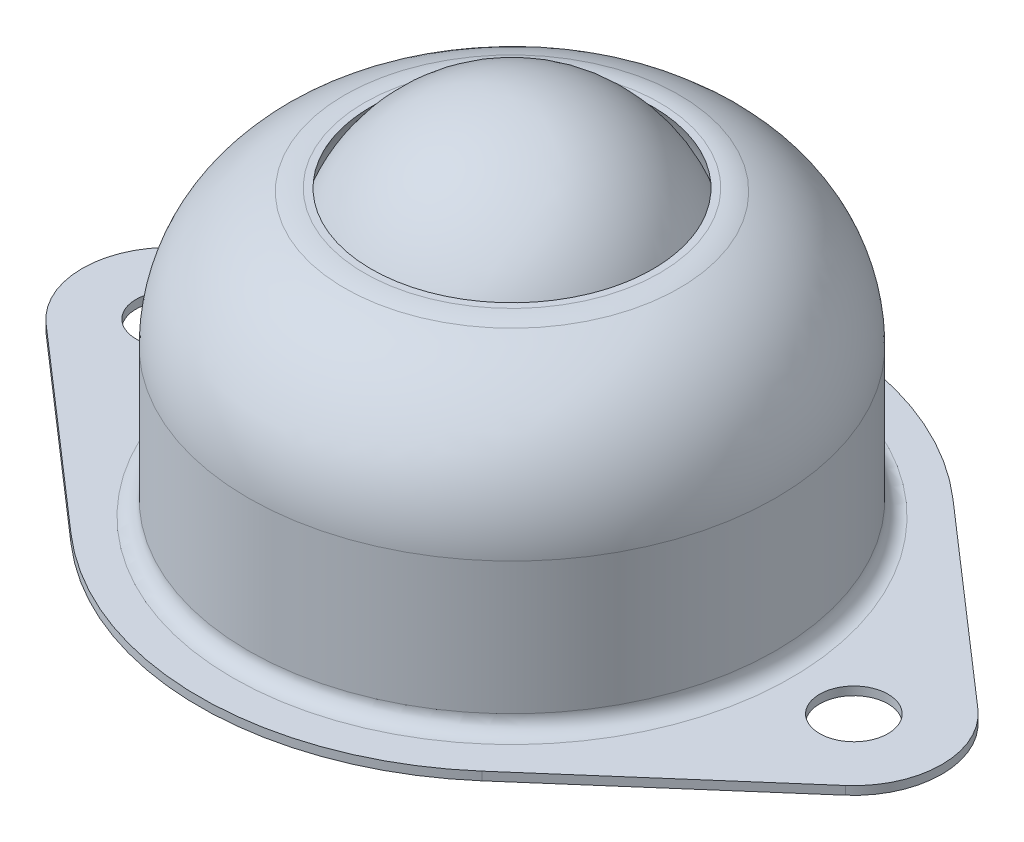
ISO-10303-21;
HEADER;
FILE_DESCRIPTION(('STEP AP214'),'2;1');
FILE_NAME('part.step','',(''),(''),'','','');
FILE_SCHEMA(('AUTOMOTIVE_DESIGN { 1 0 10303 214 1 1 1 1 }'));
ENDSEC;
DATA;
#1=APPLICATION_CONTEXT('core data for automotive mechanical design processes');
#2=APPLICATION_PROTOCOL_DEFINITION('international standard','automotive_design',2000,#1);
#3=PRODUCT_CONTEXT('',#1,'mechanical');
#4=PRODUCT('Part','Part','',(#3));
#5=PRODUCT_RELATED_PRODUCT_CATEGORY('part','',(#4));
#6=PRODUCT_DEFINITION_FORMATION('','',#4);
#7=PRODUCT_DEFINITION_CONTEXT('part definition',#1,'design');
#8=PRODUCT_DEFINITION('design','',#6,#7);
#9=PRODUCT_DEFINITION_SHAPE('','',#8);
#10=(LENGTH_UNIT() NAMED_UNIT(*) SI_UNIT(.MILLI.,.METRE.));
#11=(NAMED_UNIT(*) PLANE_ANGLE_UNIT() SI_UNIT($,.RADIAN.));
#12=(NAMED_UNIT(*) SI_UNIT($,.STERADIAN.) SOLID_ANGLE_UNIT());
#13=UNCERTAINTY_MEASURE_WITH_UNIT(LENGTH_MEASURE(1.E-05),#10,'distance_accuracy_value','');
#14=(GEOMETRIC_REPRESENTATION_CONTEXT(3) GLOBAL_UNCERTAINTY_ASSIGNED_CONTEXT((#13)) GLOBAL_UNIT_ASSIGNED_CONTEXT((#10,
#11,#12)) REPRESENTATION_CONTEXT('',''));
#15=CARTESIAN_POINT('',(0.,0.,0.));
#16=DIRECTION('',(0.,0.,1.));
#17=DIRECTION('',(1.,0.,0.));
#18=AXIS2_PLACEMENT_3D('',#15,#16,#17);
#19=CARTESIAN_POINT('',(0.,17.4625,0.));
#20=DIRECTION('',(1.,0.,0.));
#21=DIRECTION('',(0.,-1.,0.));
#22=AXIS2_PLACEMENT_3D('',#19,#20,#21);
#23=SPHERICAL_SURFACE('',#22,12.7);
#24=CARTESIAN_POINT('',(12.7,17.4625,0.));
#25=VERTEX_POINT('',#24);
#26=VERTEX_LOOP('',#25);
#27=FACE_BOUND('',#26,.T.);
#28=ADVANCED_FACE('P0_F31',(#27),#23,.T.);
#29=CLOSED_SHELL('',(#28));
#30=MANIFOLD_SOLID_BREP('P0_B2',#29);
#31=CARTESIAN_POINT('',(0.,17.4625,0.));
#32=DIRECTION('',(1.,0.,0.));
#33=DIRECTION('',(0.,-1.,0.));
#34=AXIS2_PLACEMENT_3D('',#31,#32,#33);
#35=SPHERICAL_SURFACE('',#34,13.081);
#36=CARTESIAN_POINT('',(13.081,17.4625,0.));
#37=VERTEX_POINT('',#36);
#38=VERTEX_LOOP('',#37);
#39=FACE_BOUND('',#38,.T.);
#40=CARTESIAN_POINT('',(-13.081,17.4625,0.));
#41=VERTEX_POINT('',#40);
#42=VERTEX_LOOP('',#41);
#43=FACE_BOUND('',#42,.T.);
#44=CARTESIAN_POINT('',(11.4363482370904,23.8125,0.));
#45=CARTESIAN_POINT('',(11.4363464651006,23.8125,-0.321064718853675));
#46=CARTESIAN_POINT('',(11.4228165397614,23.8125,-0.642187616067949));
#47=CARTESIAN_POINT('',(11.3687752471854,23.8125,-1.2822831873216));
#48=CARTESIAN_POINT('',(11.3282505814105,23.8125,-1.60125472325458));
#49=CARTESIAN_POINT('',(11.2203938728238,23.8125,-2.23526421980352));
#50=CARTESIAN_POINT('',(11.1530111397144,23.8125,-2.55029357394347));
#51=CARTESIAN_POINT('',(10.9919181130495,23.8125,-3.17354712938374));
#52=CARTESIAN_POINT('',(10.8982076555274,23.8125,-3.48177128828905));
#53=CARTESIAN_POINT('',(10.6852181213579,23.8125,-4.08896023589708));
#54=CARTESIAN_POINT('',(10.5659609070567,23.8125,-4.38793269318859));
#55=CARTESIAN_POINT('',(10.3026748499466,23.8125,-4.97477448169461));
#56=CARTESIAN_POINT('',(10.158645256946,23.8125,-5.2626434763353));
#57=CARTESIAN_POINT('',(9.84691720443379,23.8125,-5.82508463307515));
#58=CARTESIAN_POINT('',(9.67923026351429,23.8125,-6.09966317932872));
#59=CARTESIAN_POINT('',(9.32132779111319,23.8125,-6.63371962388473));
#60=CARTESIAN_POINT('',(9.13111243098029,23.8125,-6.89319763701779));
#61=CARTESIAN_POINT('',(8.72946422940428,23.8125,-7.3952608299586));
#62=CARTESIAN_POINT('',(8.51802722145206,23.8125,-7.637842676593));
#63=CARTESIAN_POINT('',(8.07546955467022,23.8125,-8.10433343541315));
#64=CARTESIAN_POINT('',(7.84434885652176,23.8125,-8.32824231029725));
#65=CARTESIAN_POINT('',(7.36404660321942,23.8125,-8.75581316669281));
#66=CARTESIAN_POINT('',(7.11486350623993,23.8125,-8.95947341623261));
#67=CARTESIAN_POINT('',(6.60022571327373,23.8125,-9.34507715736311));
#68=CARTESIAN_POINT('',(6.33477102357822,23.8125,-9.52702065735023));
#69=CARTESIAN_POINT('',(5.78948760375894,23.8125,-9.86789096239132));
#70=CARTESIAN_POINT('',(5.5096594145273,23.8125,-10.0268186327004));
#71=CARTESIAN_POINT('',(4.93760923566528,23.8125,-10.3205355380822));
#72=CARTESIAN_POINT('',(4.64538724562102,23.8125,-10.4553247723489));
#73=CARTESIAN_POINT('',(4.05063021208211,23.8125,-10.6998052053973));
#74=CARTESIAN_POINT('',(3.74809527909912,23.8125,-10.8094966730252));
#75=CARTESIAN_POINT('',(3.13486021244921,23.8125,-11.003003589483));
#76=CARTESIAN_POINT('',(2.82416007884726,23.8125,-11.0868190385188));
#77=CARTESIAN_POINT('',(2.19680179733197,23.8125,-11.2279784250021));
#78=CARTESIAN_POINT('',(1.88014361754577,23.8125,-11.2853222207963));
#79=CARTESIAN_POINT('',(1.24312210829783,23.8125,-11.3731299594902));
#80=CARTESIAN_POINT('',(0.922758778815074,23.8125,-11.4035939022374));
#81=CARTESIAN_POINT('',(0.280604562936458,23.8125,-11.4374253540858));
#82=CARTESIAN_POINT('',(-0.0411863234594056,23.8125,-11.440792863187));
#83=CARTESIAN_POINT('',(-0.683907911286681,23.8125,-11.4204075066819));
#84=CARTESIAN_POINT('',(-1.00483861272297,23.8125,-11.3966546412293));
#85=CARTESIAN_POINT('',(-1.64355649676614,23.8125,-11.3221976040765));
#86=CARTESIAN_POINT('',(-1.96134369618493,23.8125,-11.2714935765944));
#87=CARTESIAN_POINT('',(-2.59151706973476,23.8125,-11.1434947759947));
#88=CARTESIAN_POINT('',(-2.90390324382282,23.8125,-11.0662000026655));
#89=CARTESIAN_POINT('',(-3.52105701934832,23.8125,-10.8855682545087));
#90=CARTESIAN_POINT('',(-3.82582453913541,23.8125,-10.782231000711));
#91=CARTESIAN_POINT('',(-4.42557078209706,23.8125,-10.5502493814035));
#92=CARTESIAN_POINT('',(-4.72054950559851,23.8125,-10.4216050167389));
#93=CARTESIAN_POINT('',(-5.2986319039311,23.8125,-10.1399184648294));
#94=CARTESIAN_POINT('',(-5.58173513178282,23.8125,-9.98687536028418));
#95=CARTESIAN_POINT('',(-6.13404200830228,23.8125,-9.65748286299214));
#96=CARTESIAN_POINT('',(-6.40324565159591,23.8125,-9.48113346123432));
#97=CARTESIAN_POINT('',(-6.92581684391129,23.8125,-9.10639830044978));
#98=CARTESIAN_POINT('',(-7.17918574423292,23.8125,-8.90801442581703));
#99=CARTESIAN_POINT('',(-7.66831088577904,23.8125,-8.49060873299592));
#100=CARTESIAN_POINT('',(-7.90406716218517,23.8125,-8.27158695603422));
#101=CARTESIAN_POINT('',(-8.35624715294302,23.8125,-7.81450711235984));
#102=CARTESIAN_POINT('',(-8.57267466049871,23.8125,-7.57645279817252));
#103=CARTESIAN_POINT('',(-8.9847128481599,23.8125,-7.0829601461183));
#104=CARTESIAN_POINT('',(-9.18032336993133,23.8125,-6.82752167605167));
#105=CARTESIAN_POINT('',(-9.54942533441807,23.8125,-6.30094957906027));
#106=CARTESIAN_POINT('',(-9.72290599313476,23.8125,-6.02980839298448));
#107=CARTESIAN_POINT('',(-10.0463980769443,23.8125,-5.47388060602103));
#108=CARTESIAN_POINT('',(-10.1964102127097,23.8125,-5.18909441867183));
#109=CARTESIAN_POINT('',(-10.4720222281921,23.8125,-4.60764710662637));
#110=CARTESIAN_POINT('',(-10.5976011723826,23.8125,-4.31097605856494));
#111=CARTESIAN_POINT('',(-10.8232919948511,23.8125,-3.70809994337834));
#112=CARTESIAN_POINT('',(-10.9234040317332,23.8125,-3.4018949356426));
#113=CARTESIAN_POINT('',(-11.0972834490954,23.8125,-2.78272851252262));
#114=CARTESIAN_POINT('',(-11.1711003349139,23.8125,-2.46978098235236));
#115=CARTESIAN_POINT('',(-11.2921017596822,23.8125,-1.83890741590195));
#116=CARTESIAN_POINT('',(-11.3392994039618,23.8125,-1.52098390879777));
#117=CARTESIAN_POINT('',(-11.3941243901092,23.8125,-1.00213945296147));
#118=CARTESIAN_POINT('',(-11.4099533895389,23.8125,-0.802049457802363));
#119=CARTESIAN_POINT('',(-11.4310658667841,23.8125,-0.401313883953147));
#120=CARTESIAN_POINT('',(-11.4363493445997,23.8125,-0.200668305263037));
#121=CARTESIAN_POINT('',(-11.4363464651007,23.8125,0.321064718849707));
#122=CARTESIAN_POINT('',(-11.4228165397616,23.8125,0.642187616063984));
#123=CARTESIAN_POINT('',(-11.3687752471859,23.8125,1.28228318731765));
#124=CARTESIAN_POINT('',(-11.3282505814111,23.8125,1.60125472325064));
#125=CARTESIAN_POINT('',(-11.2203938728246,23.8125,2.23526421979963));
#126=CARTESIAN_POINT('',(-11.1530111397153,23.8125,2.55029357393959));
#127=CARTESIAN_POINT('',(-10.9919181130506,23.8125,3.17354712937992));
#128=CARTESIAN_POINT('',(-10.8982076555286,23.8125,3.48177128828527));
#129=CARTESIAN_POINT('',(-10.6852181213593,23.8125,4.08896023589338));
#130=CARTESIAN_POINT('',(-10.5659609070582,23.8125,4.38793269318492));
#131=CARTESIAN_POINT('',(-10.3026748499483,23.8125,4.97477448169104));
#132=CARTESIAN_POINT('',(-10.1586452569478,23.8125,5.26264347633178));
#133=CARTESIAN_POINT('',(-9.84691720443583,23.8125,5.82508463307174));
#134=CARTESIAN_POINT('',(-9.67923026351642,23.8125,6.09966317932537));
#135=CARTESIAN_POINT('',(-9.32132779111551,23.8125,6.6337196238815));
#136=CARTESIAN_POINT('',(-9.1311124309827,23.8125,6.89319763701463));
#137=CARTESIAN_POINT('',(-8.72946422940687,23.8125,7.39526082995558));
#138=CARTESIAN_POINT('',(-8.51802722145473,23.8125,7.63784267659004));
#139=CARTESIAN_POINT('',(-8.07546955467305,23.8125,8.10433343541035));
#140=CARTESIAN_POINT('',(-7.84434885652467,23.8125,8.32824231029453));
#141=CARTESIAN_POINT('',(-7.36404660322248,23.8125,8.75581316669026));
#142=CARTESIAN_POINT('',(-7.11486350624306,23.8125,8.95947341623014));
#143=CARTESIAN_POINT('',(-6.60022571327699,23.8125,9.34507715736082));
#144=CARTESIAN_POINT('',(-6.33477102358155,23.8125,9.52702065734803));
#145=CARTESIAN_POINT('',(-5.78948760376239,23.8125,9.86789096238931));
#146=CARTESIAN_POINT('',(-5.5096594145308,23.8125,10.0268186326985));
#147=CARTESIAN_POINT('',(-4.93760923566889,23.8125,10.3205355380805));
#148=CARTESIAN_POINT('',(-4.64538724562467,23.8125,10.4553247723472));
#149=CARTESIAN_POINT('',(-4.05063021208583,23.8125,10.6998052053959));
#150=CARTESIAN_POINT('',(-3.74809527910289,23.8125,10.8094966730239));
#151=CARTESIAN_POINT('',(-3.13486021245304,23.8125,11.0030035894819));
#152=CARTESIAN_POINT('',(-2.82416007885113,23.8125,11.0868190385178));
#153=CARTESIAN_POINT('',(-2.19680179733588,23.8125,11.2279784250013));
#154=CARTESIAN_POINT('',(-1.8801436175497,23.8125,11.2853222207956));
#155=CARTESIAN_POINT('',(-1.24312210830179,23.8125,11.3731299594897));
#156=CARTESIAN_POINT('',(-0.922758778819049,23.8125,11.4035939022371));
#157=CARTESIAN_POINT('',(-0.280604562940446,23.8125,11.4374253540857));
#158=CARTESIAN_POINT('',(0.0411863234554154,23.8125,11.440792863187));
#159=CARTESIAN_POINT('',(0.683907911282697,23.8125,11.4204075066821));
#160=CARTESIAN_POINT('',(1.004838612719,23.8125,11.3966546412297));
#161=CARTESIAN_POINT('',(1.64355649676219,23.8125,11.322197604077));
#162=CARTESIAN_POINT('',(1.96134369618099,23.8125,11.271493576595));
#163=CARTESIAN_POINT('',(2.59151706973087,23.8125,11.1434947759956));
#164=CARTESIAN_POINT('',(2.90390324381895,23.8125,11.0662000026665));
#165=CARTESIAN_POINT('',(3.52105701934452,23.8125,10.88556825451));
#166=CARTESIAN_POINT('',(3.82582453913164,23.8125,10.7822310007124));
#167=CARTESIAN_POINT('',(4.42557078209338,23.8125,10.5502493814051));
#168=CARTESIAN_POINT('',(4.72054950559487,23.8125,10.4216050167405));
#169=CARTESIAN_POINT('',(5.29863190392756,23.8125,10.1399184648312));
#170=CARTESIAN_POINT('',(5.58173513177933,23.8125,9.98687536028611));
#171=CARTESIAN_POINT('',(6.1340420082989,23.8125,9.65748286299427));
#172=CARTESIAN_POINT('',(6.4032456515926,23.8125,9.48113346123654));
#173=CARTESIAN_POINT('',(6.92581684390811,23.8125,9.10639830045218));
#174=CARTESIAN_POINT('',(7.1791857442298,23.8125,8.90801442581953));
#175=CARTESIAN_POINT('',(7.66831088577608,23.8125,8.49060873299858));
#176=CARTESIAN_POINT('',(7.90406716218228,23.8125,8.27158695603696));
#177=CARTESIAN_POINT('',(8.35624715294028,23.8125,7.81450711236274));
#178=CARTESIAN_POINT('',(8.57267466049606,23.8125,7.57645279817549));
#179=CARTESIAN_POINT('',(8.98471284815743,23.8125,7.08296014612142));
#180=CARTESIAN_POINT('',(9.18032336992894,23.8125,6.82752167605486));
#181=CARTESIAN_POINT('',(9.54942533441586,23.8125,6.30094957906359));
#182=CARTESIAN_POINT('',(9.72290599313264,23.8125,6.02980839298785));
#183=CARTESIAN_POINT('',(10.0463980769424,23.8125,5.47388060602452));
#184=CARTESIAN_POINT('',(10.1964102127079,23.8125,5.18909441867536));
#185=CARTESIAN_POINT('',(10.4720222281904,23.8125,4.60764710663));
#186=CARTESIAN_POINT('',(10.5976011723811,23.8125,4.31097605856862));
#187=CARTESIAN_POINT('',(10.8232919948498,23.8125,3.70809994338209));
#188=CARTESIAN_POINT('',(10.923404031732,23.8125,3.40189493564639));
#189=CARTESIAN_POINT('',(11.0972834490944,23.8125,2.78272851252647));
#190=CARTESIAN_POINT('',(11.1711003349131,23.8125,2.46978098235624));
#191=CARTESIAN_POINT('',(11.2921017596816,23.8125,1.83890741590587));
#192=CARTESIAN_POINT('',(11.3392994039613,23.8125,1.5209839088017));
#193=CARTESIAN_POINT('',(11.394124390109,23.8125,1.0021394529641));
#194=CARTESIAN_POINT('',(11.4099533895388,23.8125,0.80204945780368));
#195=CARTESIAN_POINT('',(11.4310658667842,23.8125,0.401313883951825));
#196=CARTESIAN_POINT('',(11.4363493445997,23.8125,0.200668305260392));
#197=CARTESIAN_POINT('',(11.4363482370904,23.8125,0.));
#198=B_SPLINE_CURVE_WITH_KNOTS('',3,(#44,#45,#46,#47,#48,#49,#50,#51,#52,#53,#54,#55,#56,#57,
#58,#59,#60,#61,#62,#63,#64,#65,#66,#67,#68,#69,#70,#71,#72,#73,#74,#75,#76,#77,#78,#79,#80,#81,
#82,#83,#84,#85,#86,#87,#88,#89,#90,#91,#92,#93,#94,#95,#96,#97,#98,#99,#100,#101,#102,#103,
#104,#105,#106,#107,#108,#109,#110,#111,#112,#113,#114,#115,#116,#117,#118,#119,#120,#121,#122,
#123,#124,#125,#126,#127,#128,#129,#130,#131,#132,#133,#134,#135,#136,#137,#138,#139,#140,#141,
#142,#143,#144,#145,#146,#147,#148,#149,#150,#151,#152,#153,#154,#155,#156,#157,#158,#159,#160,
#161,#162,#163,#164,#165,#166,#167,#168,#169,#170,#171,#172,#173,#174,#175,#176,#177,#178,#179,
#180,#181,#182,#183,#184,#185,#186,#187,#188,#189,#190,#191,#192,#193,#194,#195,#196,#197),
.UNSPECIFIED.,.T.,.F.,(4,2,2,2,2,2,2,2,2,2,2,2,2,2,2,2,2,2,2,2,2,2,2,2,2,2,2,2,2,2,2,2,2,2,2,2,
2,2,2,2,2,2,2,2,2,2,2,2,2,2,2,2,2,2,2,2,2,2,2,2,2,2,2,2,2,2,2,2,2,2,2,2,2,2,2,2,4),(0.,
0.96301045674964,1.92649567678627,2.89180799698352,3.857126329189,4.82162184030589,
5.78614656476355,6.75020327951492,7.71425266222715,8.67849169124256,9.64273264640336,
10.607056007348,11.571378995452,12.5356657214665,13.4999524796831,14.4642289080202,
15.428505328683,16.3927869092561,17.3570684952986,18.3213500813412,19.2856316619142,
20.249908082577,21.2141845109141,22.1784712691308,23.1427579951453,24.1070809832492,
25.0714043441939,26.0356452993547,26.9998843283701,27.9639337110823,28.9279904258337,
29.8925151502913,30.8570106614082,31.8223289936137,32.787641313811,33.7511265338476,
34.7141369905972,35.3160270923587,35.9179171941201,36.8809276508697,37.8444128709063,
38.8097251911036,39.7750435233091,40.739539034426,41.7040637588836,42.668120473635,
43.6321698563472,44.5964088853626,45.5606498405235,46.5249732014681,47.4892961895721,
48.4535829155866,49.4178696738032,50.3821461021403,51.3464225228031,52.3107041033762,
53.2749856894187,54.2392672754613,55.2035488560343,56.1678252766971,57.1321017050342,
58.0963884632509,59.0606751892654,60.0249981773694,60.989321538314,61.9535624934748,
62.9178015224902,63.8818509052024,64.8459076199538,65.8104323444115,66.7749278555284,
67.7402461877338,68.7055585079311,69.6690437279677,70.6320541847173,71.2339442864827,
71.8358343882481),.UNSPECIFIED.);
#199=CARTESIAN_POINT('',(11.4363482370904,23.8125,0.));
#200=VERTEX_POINT('',#199);
#201=EDGE_CURVE('P1_E111',#200,#200,#198,.T.);
#202=ORIENTED_EDGE('',*,*,#201,.T.);
#203=EDGE_LOOP('',(#202));
#204=FACE_BOUND('',#203,.T.);
#205=ADVANCED_FACE('P1_F19',(#39,#43,#204),#35,.F.);
#206=CARTESIAN_POINT('',(-12.7,23.8125,0.));
#207=DIRECTION('',(0.,-1.,0.));
#208=DIRECTION('',(1.,0.,0.));
#209=AXIS2_PLACEMENT_3D('',#206,#207,#208);
#210=PLANE('',#209);
#211=ORIENTED_EDGE('',*,*,#201,.F.);
#212=EDGE_LOOP('',(#211));
#213=FACE_BOUND('',#212,.T.);
#214=CARTESIAN_POINT('',(0.,23.8125,0.));
#215=DIRECTION('',(0.,-1.,0.));
#216=DIRECTION('',(1.,0.,0.));
#217=AXIS2_PLACEMENT_3D('',#214,#215,#216);
#218=CIRCLE('',#217,11.9998102162029);
#219=CARTESIAN_POINT('',(11.9998102162029,23.8125,0.));
#220=VERTEX_POINT('',#219);
#221=CARTESIAN_POINT('',(-11.9998102162029,23.8125,0.));
#222=VERTEX_POINT('',#221);
#223=EDGE_CURVE('P1_E114',#220,#222,#218,.T.);
#224=ORIENTED_EDGE('',*,*,#223,.F.);
#225=CARTESIAN_POINT('',(0.,23.8125,0.));
#226=DIRECTION('',(0.,-1.,0.));
#227=DIRECTION('',(-1.,0.,0.));
#228=AXIS2_PLACEMENT_3D('',#225,#226,#227);
#229=CIRCLE('',#228,11.9998102162029);
#230=EDGE_CURVE('P1_E120',#222,#220,#229,.T.);
#231=ORIENTED_EDGE('',*,*,#230,.F.);
#232=EDGE_LOOP('',(#224,#231));
#233=FACE_BOUND('',#232,.T.);
#234=ADVANCED_FACE('P1_F107',(#213,#233),#210,.F.);
#235=CARTESIAN_POINT('',(0.,18.7325,0.));
#236=DIRECTION('',(0.,-1.,0.));
#237=DIRECTION('',(1.,0.,0.));
#238=AXIS2_PLACEMENT_3D('',#235,#236,#237);
#239=TOROIDAL_SURFACE('',#238,11.9998102162029,5.08);
#240=ORIENTED_EDGE('',*,*,#223,.T.);
#241=ORIENTED_EDGE('',*,*,#230,.T.);
#242=EDGE_LOOP('',(#240,#241));
#243=FACE_BOUND('',#242,.T.);
#244=CARTESIAN_POINT('',(0.,23.5530221339387,0.));
#245=DIRECTION('',(0.,1.,0.));
#246=DIRECTION('',(-1.,0.,0.));
#247=AXIS2_PLACEMENT_3D('',#244,#245,#246);
#248=CIRCLE('',#247,13.6026097533275);
#249=CARTESIAN_POINT('',(-13.6026097533275,23.5530221339387,0.));
#250=VERTEX_POINT('',#249);
#251=EDGE_CURVE('P1_E299',#250,#250,#248,.F.);
#252=ORIENTED_EDGE('',*,*,#251,.F.);
#253=EDGE_LOOP('',(#252));
#254=FACE_BOUND('',#253,.T.);
#255=ADVANCED_FACE('P1_F134',(#243,#254),#239,.T.);
#256=CARTESIAN_POINT('',(-9.99403409090908,12.7,0.));
#257=DIRECTION('',(0.,0.,1.));
#258=DIRECTION('',(-1.,0.,0.));
#259=AXIS2_PLACEMENT_3D('',#256,#257,#258);
#260=CIRCLE('',#259,11.4372159090909);
#261=TRIMMED_CURVE('',#260,(PARAMETER_VALUE(-2.63379399037406)),
(PARAMETER_VALUE(2.63379399037406)),.T.,.PARAMETER.);
#262=CARTESIAN_POINT('',(0.,12.7,0.));
#263=DIRECTION('',(0.,1.,0.));
#264=AXIS1_PLACEMENT('',#262,#263);
#265=SURFACE_OF_REVOLUTION('',#261,#264);
#266=CARTESIAN_POINT('',(0.,12.7,0.));
#267=DIRECTION('',(0.,1.,0.));
#268=DIRECTION('',(-1.,0.,0.));
#269=AXIS2_PLACEMENT_3D('',#266,#267,#268);
#270=CIRCLE('',#269,21.43125);
#271=CARTESIAN_POINT('',(-21.43125,12.7,0.));
#272=VERTEX_POINT('',#271);
#273=EDGE_CURVE('P1_E303',#272,#272,#270,.F.);
#274=ORIENTED_EDGE('',*,*,#273,.F.);
#275=EDGE_LOOP('',(#274));
#276=FACE_BOUND('',#275,.T.);
#277=ORIENTED_EDGE('',*,*,#251,.T.);
#278=EDGE_LOOP('',(#277));
#279=FACE_BOUND('',#278,.T.);
#280=ADVANCED_FACE('P1_F315',(#276,#279),#265,.F.);
#281=CARTESIAN_POINT('',(0.,17.4625,0.));
#282=DIRECTION('',(1.,0.,0.));
#283=DIRECTION('',(0.,-1.,0.));
#284=AXIS2_PLACEMENT_3D('',#281,#282,#283);
#285=SPHERICAL_SURFACE('',#284,14.097);
#286=CARTESIAN_POINT('',(-14.097,17.4625,0.));
#287=VERTEX_POINT('',#286);
#288=VERTEX_LOOP('',#287);
#289=FACE_BOUND('',#288,.T.);
#290=CARTESIAN_POINT('',(14.097,17.4625,0.));
#291=VERTEX_POINT('',#290);
#292=VERTEX_LOOP('',#291);
#293=FACE_BOUND('',#292,.T.);
#294=CARTESIAN_POINT('',(0.,22.6415928639884,0.));
#295=DIRECTION('',(0.,-1.,0.));
#296=DIRECTION('',(1.,0.,0.));
#297=AXIS2_PLACEMENT_3D('',#294,#295,#296);
#298=CIRCLE('',#297,13.1111557883426);
#299=CARTESIAN_POINT('',(13.1111557883426,22.6415928639884,0.));
#300=VERTEX_POINT('',#299);
#301=EDGE_CURVE('P1_E126',#300,#300,#298,.T.);
#302=ORIENTED_EDGE('',*,*,#301,.T.);
#303=EDGE_LOOP('',(#302));
#304=FACE_BOUND('',#303,.T.);
#305=ADVANCED_FACE('P1_F318',(#289,#293,#304),#285,.T.);
#306=CARTESIAN_POINT('',(0.,23.8125,0.));
#307=DIRECTION('',(0.,1.,0.));
#308=DIRECTION('',(-1.,0.,0.));
#309=AXIS2_PLACEMENT_3D('',#306,#307,#308);
#310=CYLINDRICAL_SURFACE('',#309,21.43125);
#311=CARTESIAN_POINT('',(0.,1.9558,0.));
#312=DIRECTION('',(0.,1.,0.));
#313=DIRECTION('',(0.,0.,1.));
#314=AXIS2_PLACEMENT_3D('',#311,#312,#313);
#315=CIRCLE('',#314,21.43125);
#316=CARTESIAN_POINT('',(0.,1.9558,21.43125));
#317=VERTEX_POINT('',#316);
#318=EDGE_CURVE('P1_E489',#317,#317,#315,.T.);
#319=ORIENTED_EDGE('',*,*,#318,.T.);
#320=EDGE_LOOP('',(#319));
#321=FACE_BOUND('',#320,.T.);
#322=ORIENTED_EDGE('',*,*,#273,.T.);
#323=EDGE_LOOP('',(#322));
#324=FACE_BOUND('',#323,.T.);
#325=ADVANCED_FACE('P1_F321',(#321,#324),#310,.T.);
#326=CARTESIAN_POINT('',(0.,18.7325,0.));
#327=DIRECTION('',(0.,-1.,0.));
#328=DIRECTION('',(1.,0.,0.));
#329=AXIS2_PLACEMENT_3D('',#326,#327,#328);
#330=TOROIDAL_SURFACE('',#329,11.9998102162029,4.064);
#331=ORIENTED_EDGE('',*,*,#301,.F.);
#332=EDGE_LOOP('',(#331));
#333=FACE_BOUND('',#332,.T.);
#334=CARTESIAN_POINT('',(0.,22.588917707151,0.));
#335=DIRECTION('',(0.,1.,0.));
#336=DIRECTION('',(-1.,0.,0.));
#337=AXIS2_PLACEMENT_3D('',#334,#335,#336);
#338=CIRCLE('',#337,13.2820498459026);
#339=CARTESIAN_POINT('',(-13.2820498459026,22.588917707151,0.));
#340=VERTEX_POINT('',#339);
#341=EDGE_CURVE('P1_E484',#340,#340,#338,.F.);
#342=ORIENTED_EDGE('',*,*,#341,.T.);
#343=EDGE_LOOP('',(#342));
#344=FACE_BOUND('',#343,.T.);
#345=ADVANCED_FACE('P1_F281',(#333,#344),#330,.F.);
#346=CARTESIAN_POINT('',(0.,1.9558,0.));
#347=DIRECTION('',(0.,1.,0.));
#348=DIRECTION('',(0.,0.,1.));
#349=AXIS2_PLACEMENT_3D('',#346,#347,#348);
#350=TOROIDAL_SURFACE('',#349,22.70125,1.27);
#351=ORIENTED_EDGE('',*,*,#318,.F.);
#352=EDGE_LOOP('',(#351));
#353=FACE_BOUND('',#352,.T.);
#354=CARTESIAN_POINT('',(0.,0.685800000000001,0.));
#355=DIRECTION('',(0.,1.,0.));
#356=DIRECTION('',(0.,0.,-1.));
#357=AXIS2_PLACEMENT_3D('',#354,#355,#356);
#358=CIRCLE('',#357,22.70125);
#359=CARTESIAN_POINT('',(0.,0.6858,22.70125));
#360=VERTEX_POINT('',#359);
#361=CARTESIAN_POINT('',(0.,0.6858,-22.70125));
#362=VERTEX_POINT('',#361);
#363=EDGE_CURVE('P1_E480',#360,#362,#358,.F.);
#364=ORIENTED_EDGE('',*,*,#363,.F.);
#365=CARTESIAN_POINT('',(0.,0.685800000000001,0.));
#366=DIRECTION('',(0.,1.,0.));
#367=DIRECTION('',(0.,0.,1.));
#368=AXIS2_PLACEMENT_3D('',#365,#366,#367);
#369=CIRCLE('',#368,22.70125);
#370=EDGE_CURVE('P1_E270',#362,#360,#369,.F.);
#371=ORIENTED_EDGE('',*,*,#370,.F.);
#372=EDGE_LOOP('',(#364,#371));
#373=FACE_BOUND('',#372,.T.);
#374=ADVANCED_FACE('P1_F277',(#353,#373),#350,.F.);
#375=CARTESIAN_POINT('',(-9.99403409090908,12.7,0.));
#376=DIRECTION('',(0.,0.,1.));
#377=DIRECTION('',(-1.,0.,0.));
#378=AXIS2_PLACEMENT_3D('',#375,#376,#377);
#379=CIRCLE('',#378,10.4212159090909);
#380=TRIMMED_CURVE('',#379,(PARAMETER_VALUE(-2.85427851944641)),
(PARAMETER_VALUE(2.85427851944641)),.T.,.PARAMETER.);
#381=CARTESIAN_POINT('',(0.,12.7,0.));
#382=DIRECTION('',(0.,1.,0.));
#383=AXIS1_PLACEMENT('',#381,#382);
#384=SURFACE_OF_REVOLUTION('',#380,#383);
#385=CARTESIAN_POINT('',(0.,12.7,0.));
#386=DIRECTION('',(0.,1.,0.));
#387=DIRECTION('',(-1.,0.,0.));
#388=AXIS2_PLACEMENT_3D('',#385,#386,#387);
#389=CIRCLE('',#388,20.41525);
#390=CARTESIAN_POINT('',(-20.41525,12.7,0.));
#391=VERTEX_POINT('',#390);
#392=EDGE_CURVE('P1_E266',#391,#391,#389,.F.);
#393=ORIENTED_EDGE('',*,*,#392,.T.);
#394=EDGE_LOOP('',(#393));
#395=FACE_BOUND('',#394,.T.);
#396=ORIENTED_EDGE('',*,*,#341,.F.);
#397=EDGE_LOOP('',(#396));
#398=FACE_BOUND('',#397,.T.);
#399=ADVANCED_FACE('P1_F229',(#395,#398),#384,.T.);
#400=CARTESIAN_POINT('',(0.,0.6858,0.));
#401=DIRECTION('',(0.,1.,0.));
#402=DIRECTION('',(0.,0.,1.));
#403=AXIS2_PLACEMENT_3D('',#400,#401,#402);
#404=PLANE('',#403);
#405=CARTESIAN_POINT('',(-27.78125,0.6858,0.));
#406=DIRECTION('',(0.,-1.,0.));
#407=DIRECTION('',(0.,0.,-1.));
#408=AXIS2_PLACEMENT_3D('',#405,#406,#407);
#409=CIRCLE('',#408,2.778125);
#410=CARTESIAN_POINT('',(-27.78125,0.6858,-2.778125));
#411=VERTEX_POINT('',#410);
#412=EDGE_CURVE('P1_E269',#411,#411,#409,.T.);
#413=ORIENTED_EDGE('',*,*,#412,.T.);
#414=EDGE_LOOP('',(#413));
#415=FACE_BOUND('',#414,.T.);
#416=CARTESIAN_POINT('',(27.78125,0.6858,0.));
#417=DIRECTION('',(0.,-1.,0.));
#418=DIRECTION('',(0.,0.,-1.));
#419=AXIS2_PLACEMENT_3D('',#416,#417,#418);
#420=CIRCLE('',#419,7.14375);
#421=CARTESIAN_POINT('',(32.4757142857143,0.6858,-5.3847162536807));
#422=VERTEX_POINT('',#421);
#423=CARTESIAN_POINT('',(32.4757142857143,0.6858,5.38471625368068));
#424=VERTEX_POINT('',#423);
#425=EDGE_CURVE('P1_E252',#422,#424,#420,.T.);
#426=ORIENTED_EDGE('',*,*,#425,.F.);
#427=DIRECTION('',(0.753766054758452,0.,0.657142857142857));
#428=VECTOR('',#427,1.);
#429=CARTESIAN_POINT('',(32.4757142857143,0.6858,-5.3847162536807));
#430=LINE('',#429,#428);
#431=CARTESIAN_POINT('',(16.6914285714286,0.6858,-19.1456577908647));
#432=VERTEX_POINT('',#431);
#433=EDGE_CURVE('P1_E238',#422,#432,#430,.F.);
#434=ORIENTED_EDGE('',*,*,#433,.T.);
#435=CARTESIAN_POINT('',(0.,0.6858,0.));
#436=DIRECTION('',(0.,-1.,0.));
#437=DIRECTION('',(0.,0.,-1.));
#438=AXIS2_PLACEMENT_3D('',#435,#436,#437);
#439=CIRCLE('',#438,25.4);
#440=CARTESIAN_POINT('',(-16.6914285714286,0.6858,-19.1456577908647));
#441=VERTEX_POINT('',#440);
#442=EDGE_CURVE('P1_E198',#441,#432,#439,.T.);
#443=ORIENTED_EDGE('',*,*,#442,.F.);
#444=DIRECTION('',(0.753766054758452,0.,-0.657142857142857));
#445=VECTOR('',#444,1.);
#446=CARTESIAN_POINT('',(-16.6914285714286,0.6858,-19.1456577908647));
#447=LINE('',#446,#445);
#448=CARTESIAN_POINT('',(-32.4757142857143,0.6858,-5.38471625368069));
#449=VERTEX_POINT('',#448);
#450=EDGE_CURVE('P1_E260',#441,#449,#447,.F.);
#451=ORIENTED_EDGE('',*,*,#450,.T.);
#452=CARTESIAN_POINT('',(-27.78125,0.6858,0.));
#453=DIRECTION('',(0.,-1.,0.));
#454=DIRECTION('',(0.,0.,-1.));
#455=AXIS2_PLACEMENT_3D('',#452,#453,#454);
#456=CIRCLE('',#455,7.14375);
#457=CARTESIAN_POINT('',(-32.4757142857143,0.6858,5.38471625368069));
#458=VERTEX_POINT('',#457);
#459=EDGE_CURVE('P1_E264',#458,#449,#456,.T.);
#460=ORIENTED_EDGE('',*,*,#459,.F.);
#461=DIRECTION('',(-0.753766054758453,0.,-0.657142857142857));
#462=VECTOR('',#461,1.);
#463=CARTESIAN_POINT('',(-32.4757142857143,0.6858,5.38471625368069));
#464=LINE('',#463,#462);
#465=CARTESIAN_POINT('',(-16.6914285714286,0.6858,19.1456577908647));
#466=VERTEX_POINT('',#465);
#467=EDGE_CURVE('P1_E254',#458,#466,#464,.F.);
#468=ORIENTED_EDGE('',*,*,#467,.T.);
#469=CARTESIAN_POINT('',(0.,0.6858,0.));
#470=DIRECTION('',(0.,-1.,0.));
#471=DIRECTION('',(0.,0.,-1.));
#472=AXIS2_PLACEMENT_3D('',#469,#470,#471);
#473=CIRCLE('',#472,25.4);
#474=CARTESIAN_POINT('',(16.6914285714286,0.6858,19.1456577908647));
#475=VERTEX_POINT('',#474);
#476=EDGE_CURVE('P1_E258',#475,#466,#473,.T.);
#477=ORIENTED_EDGE('',*,*,#476,.F.);
#478=DIRECTION('',(-0.753766054758452,0.,0.657142857142857));
#479=VECTOR('',#478,1.);
#480=CARTESIAN_POINT('',(16.6914285714286,0.6858,19.1456577908647));
#481=LINE('',#480,#479);
#482=EDGE_CURVE('P1_E248',#475,#424,#481,.F.);
#483=ORIENTED_EDGE('',*,*,#482,.T.);
#484=EDGE_LOOP('',(#426,#434,#443,#451,#460,#468,#477,#483));
#485=FACE_BOUND('',#484,.T.);
#486=CARTESIAN_POINT('',(27.78125,0.6858,0.));
#487=DIRECTION('',(0.,-1.,0.));
#488=DIRECTION('',(0.,0.,-1.));
#489=AXIS2_PLACEMENT_3D('',#486,#487,#488);
#490=CIRCLE('',#489,2.778125);
#491=CARTESIAN_POINT('',(27.78125,0.6858,-2.77812500000001));
#492=VERTEX_POINT('',#491);
#493=EDGE_CURVE('P1_E192',#492,#492,#490,.T.);
#494=ORIENTED_EDGE('',*,*,#493,.T.);
#495=EDGE_LOOP('',(#494));
#496=FACE_BOUND('',#495,.T.);
#497=ORIENTED_EDGE('',*,*,#363,.T.);
#498=ORIENTED_EDGE('',*,*,#370,.T.);
#499=EDGE_LOOP('',(#497,#498));
#500=FACE_BOUND('',#499,.T.);
#501=ADVANCED_FACE('P1_F218',(#415,#485,#496,#500),#404,.T.);
#502=CARTESIAN_POINT('',(0.,23.8125,0.));
#503=DIRECTION('',(0.,1.,0.));
#504=DIRECTION('',(-1.,0.,0.));
#505=AXIS2_PLACEMENT_3D('',#502,#503,#504);
#506=CYLINDRICAL_SURFACE('',#505,20.41525);
#507=CARTESIAN_POINT('',(0.,1.9558,0.));
#508=DIRECTION('',(0.,1.,0.));
#509=DIRECTION('',(0.,0.,1.));
#510=AXIS2_PLACEMENT_3D('',#507,#508,#509);
#511=CIRCLE('',#510,20.41525);
#512=CARTESIAN_POINT('',(0.,1.9558,20.41525));
#513=VERTEX_POINT('',#512);
#514=EDGE_CURVE('P1_E190',#513,#513,#511,.T.);
#515=ORIENTED_EDGE('',*,*,#514,.F.);
#516=EDGE_LOOP('',(#515));
#517=FACE_BOUND('',#516,.T.);
#518=ORIENTED_EDGE('',*,*,#392,.F.);
#519=EDGE_LOOP('',(#518));
#520=FACE_BOUND('',#519,.T.);
#521=ADVANCED_FACE('P1_F228',(#517,#520),#506,.F.);
#522=CARTESIAN_POINT('',(-27.78125,0.6858,0.));
#523=DIRECTION('',(0.,-1.,0.));
#524=DIRECTION('',(0.,0.,-1.));
#525=AXIS2_PLACEMENT_3D('',#522,#523,#524);
#526=CYLINDRICAL_SURFACE('',#525,2.778125);
#527=CARTESIAN_POINT('',(-27.78125,0.,0.));
#528=DIRECTION('',(0.,-1.,0.));
#529=DIRECTION('',(0.,0.,-1.));
#530=AXIS2_PLACEMENT_3D('',#527,#528,#529);
#531=CIRCLE('',#530,2.778125);
#532=CARTESIAN_POINT('',(-27.78125,0.,-2.778125));
#533=VERTEX_POINT('',#532);
#534=EDGE_CURVE('P1_E184',#533,#533,#531,.T.);
#535=ORIENTED_EDGE('',*,*,#534,.T.);
#536=EDGE_LOOP('',(#535));
#537=FACE_BOUND('',#536,.T.);
#538=ORIENTED_EDGE('',*,*,#412,.F.);
#539=EDGE_LOOP('',(#538));
#540=FACE_BOUND('',#539,.T.);
#541=ADVANCED_FACE('P1_F392',(#537,#540),#526,.F.);
#542=CARTESIAN_POINT('',(-16.6914285714286,0.6858,-19.1456577908647));
#543=DIRECTION('',(0.657142857142857,0.,0.753766054758452));
#544=DIRECTION('',(0.753766054758452,0.,-0.657142857142857));
#545=AXIS2_PLACEMENT_3D('',#542,#543,#544);
#546=PLANE('',#545);
#547=DIRECTION('',(0.,-1.,0.));
#548=VECTOR('',#547,1.);
#549=CARTESIAN_POINT('',(-32.4757142857143,0.6858,-5.38471625368069));
#550=LINE('',#549,#548);
#551=CARTESIAN_POINT('',(-32.4757142857143,0.,-5.38471625368069));
#552=VERTEX_POINT('',#551);
#553=EDGE_CURVE('P1_E371',#449,#552,#550,.T.);
#554=ORIENTED_EDGE('',*,*,#553,.F.);
#555=ORIENTED_EDGE('',*,*,#450,.F.);
#556=DIRECTION('',(0.,1.,0.));
#557=VECTOR('',#556,1.);
#558=CARTESIAN_POINT('',(-16.6914285714286,0.6858,-19.1456577908647));
#559=LINE('',#558,#557);
#560=CARTESIAN_POINT('',(-16.6914285714286,0.,-19.1456577908647));
#561=VERTEX_POINT('',#560);
#562=EDGE_CURVE('P1_E265',#561,#441,#559,.T.);
#563=ORIENTED_EDGE('',*,*,#562,.F.);
#564=DIRECTION('',(-0.753766054758452,0.,0.657142857142857));
#565=VECTOR('',#564,1.);
#566=CARTESIAN_POINT('',(-16.6914285714286,0.,-19.1456577908647));
#567=LINE('',#566,#565);
#568=EDGE_CURVE('P1_E351',#561,#552,#567,.T.);
#569=ORIENTED_EDGE('',*,*,#568,.T.);
#570=EDGE_LOOP('',(#554,#555,#563,#569));
#571=FACE_BOUND('',#570,.T.);
#572=ADVANCED_FACE('P1_F394',(#571),#546,.F.);
#573=CARTESIAN_POINT('',(-27.78125,0.6858,0.));
#574=DIRECTION('',(0.,-1.,0.));
#575=DIRECTION('',(0.,0.,-1.));
#576=AXIS2_PLACEMENT_3D('',#573,#574,#575);
#577=CYLINDRICAL_SURFACE('',#576,7.14375);
#578=ORIENTED_EDGE('',*,*,#459,.T.);
#579=ORIENTED_EDGE('',*,*,#553,.T.);
#580=CARTESIAN_POINT('',(-27.78125,0.,0.));
#581=DIRECTION('',(0.,-1.,0.));
#582=DIRECTION('',(0.,0.,-1.));
#583=AXIS2_PLACEMENT_3D('',#580,#581,#582);
#584=CIRCLE('',#583,7.14375);
#585=CARTESIAN_POINT('',(-32.4757142857143,0.,5.38471625368069));
#586=VERTEX_POINT('',#585);
#587=EDGE_CURVE('P1_E451',#552,#586,#584,.F.);
#588=ORIENTED_EDGE('',*,*,#587,.T.);
#589=DIRECTION('',(0.,1.,0.));
#590=VECTOR('',#589,1.);
#591=CARTESIAN_POINT('',(-32.4757142857143,0.6858,5.38471625368069));
#592=LINE('',#591,#590);
#593=EDGE_CURVE('P1_E259',#586,#458,#592,.T.);
#594=ORIENTED_EDGE('',*,*,#593,.T.);
#595=EDGE_LOOP('',(#578,#579,#588,#594));
#596=FACE_BOUND('',#595,.T.);
#597=ADVANCED_FACE('P1_F400',(#596),#577,.T.);
#598=CARTESIAN_POINT('',(-32.4757142857143,0.6858,5.38471625368069));
#599=DIRECTION('',(0.657142857142857,0.,-0.753766054758453));
#600=DIRECTION('',(-0.753766054758453,0.,-0.657142857142857));
#601=AXIS2_PLACEMENT_3D('',#598,#599,#600);
#602=PLANE('',#601);
#603=DIRECTION('',(0.,-1.,0.));
#604=VECTOR('',#603,1.);
#605=CARTESIAN_POINT('',(-16.6914285714286,0.6858,19.1456577908647));
#606=LINE('',#605,#604);
#607=CARTESIAN_POINT('',(-16.6914285714286,0.,19.1456577908647));
#608=VERTEX_POINT('',#607);
#609=EDGE_CURVE('P1_E365',#466,#608,#606,.T.);
#610=ORIENTED_EDGE('',*,*,#609,.F.);
#611=ORIENTED_EDGE('',*,*,#467,.F.);
#612=ORIENTED_EDGE('',*,*,#593,.F.);
#613=DIRECTION('',(0.753766054758453,0.,0.657142857142857));
#614=VECTOR('',#613,1.);
#615=CARTESIAN_POINT('',(-32.4757142857143,0.,5.38471625368069));
#616=LINE('',#615,#614);
#617=EDGE_CURVE('P1_E448',#586,#608,#616,.T.);
#618=ORIENTED_EDGE('',*,*,#617,.T.);
#619=EDGE_LOOP('',(#610,#611,#612,#618));
#620=FACE_BOUND('',#619,.T.);
#621=ADVANCED_FACE('P1_F407',(#620),#602,.F.);
#622=CARTESIAN_POINT('',(0.,0.6858,0.));
#623=DIRECTION('',(0.,-1.,0.));
#624=DIRECTION('',(0.,0.,-1.));
#625=AXIS2_PLACEMENT_3D('',#622,#623,#624);
#626=CYLINDRICAL_SURFACE('',#625,25.4);
#627=ORIENTED_EDGE('',*,*,#476,.T.);
#628=ORIENTED_EDGE('',*,*,#609,.T.);
#629=CARTESIAN_POINT('',(0.,0.,0.));
#630=DIRECTION('',(0.,-1.,0.));
#631=DIRECTION('',(0.,0.,-1.));
#632=AXIS2_PLACEMENT_3D('',#629,#630,#631);
#633=CIRCLE('',#632,25.4);
#634=CARTESIAN_POINT('',(16.6914285714286,0.,19.1456577908647));
#635=VERTEX_POINT('',#634);
#636=EDGE_CURVE('P1_E447',#608,#635,#633,.F.);
#637=ORIENTED_EDGE('',*,*,#636,.T.);
#638=DIRECTION('',(0.,1.,0.));
#639=VECTOR('',#638,1.);
#640=CARTESIAN_POINT('',(16.6914285714286,0.6858,19.1456577908647));
#641=LINE('',#640,#639);
#642=EDGE_CURVE('P1_E253',#635,#475,#641,.T.);
#643=ORIENTED_EDGE('',*,*,#642,.T.);
#644=EDGE_LOOP('',(#627,#628,#637,#643));
#645=FACE_BOUND('',#644,.T.);
#646=ADVANCED_FACE('P1_F411',(#645),#626,.T.);
#647=CARTESIAN_POINT('',(16.6914285714286,0.6858,19.1456577908647));
#648=DIRECTION('',(-0.657142857142857,0.,-0.753766054758452));
#649=DIRECTION('',(-0.753766054758452,0.,0.657142857142857));
#650=AXIS2_PLACEMENT_3D('',#647,#648,#649);
#651=PLANE('',#650);
#652=DIRECTION('',(0.,-1.,0.));
#653=VECTOR('',#652,1.);
#654=CARTESIAN_POINT('',(32.4757142857143,0.6858,5.38471625368068));
#655=LINE('',#654,#653);
#656=CARTESIAN_POINT('',(32.4757142857143,0.,5.38471625368068));
#657=VERTEX_POINT('',#656);
#658=EDGE_CURVE('P1_E359',#424,#657,#655,.T.);
#659=ORIENTED_EDGE('',*,*,#658,.F.);
#660=ORIENTED_EDGE('',*,*,#482,.F.);
#661=ORIENTED_EDGE('',*,*,#642,.F.);
#662=DIRECTION('',(0.753766054758452,0.,-0.657142857142857));
#663=VECTOR('',#662,1.);
#664=CARTESIAN_POINT('',(16.6914285714286,0.,19.1456577908647));
#665=LINE('',#664,#663);
#666=EDGE_CURVE('P1_E442',#635,#657,#665,.T.);
#667=ORIENTED_EDGE('',*,*,#666,.T.);
#668=EDGE_LOOP('',(#659,#660,#661,#667));
#669=FACE_BOUND('',#668,.T.);
#670=ADVANCED_FACE('P1_F415',(#669),#651,.F.);
#671=CARTESIAN_POINT('',(27.78125,0.6858,0.));
#672=DIRECTION('',(0.,-1.,0.));
#673=DIRECTION('',(0.,0.,-1.));
#674=AXIS2_PLACEMENT_3D('',#671,#672,#673);
#675=CYLINDRICAL_SURFACE('',#674,7.14375);
#676=ORIENTED_EDGE('',*,*,#425,.T.);
#677=ORIENTED_EDGE('',*,*,#658,.T.);
#678=CARTESIAN_POINT('',(27.78125,0.,0.));
#679=DIRECTION('',(0.,-1.,0.));
#680=DIRECTION('',(0.,0.,-1.));
#681=AXIS2_PLACEMENT_3D('',#678,#679,#680);
#682=CIRCLE('',#681,7.14375);
#683=CARTESIAN_POINT('',(32.4757142857143,0.,-5.3847162536807));
#684=VERTEX_POINT('',#683);
#685=EDGE_CURVE('P1_E173',#657,#684,#682,.F.);
#686=ORIENTED_EDGE('',*,*,#685,.T.);
#687=DIRECTION('',(0.,1.,0.));
#688=VECTOR('',#687,1.);
#689=CARTESIAN_POINT('',(32.4757142857143,0.6858,-5.3847162536807));
#690=LINE('',#689,#688);
#691=EDGE_CURVE('P1_E247',#684,#422,#690,.T.);
#692=ORIENTED_EDGE('',*,*,#691,.T.);
#693=EDGE_LOOP('',(#676,#677,#686,#692));
#694=FACE_BOUND('',#693,.T.);
#695=ADVANCED_FACE('P1_F419',(#694),#675,.T.);
#696=CARTESIAN_POINT('',(32.4757142857143,0.6858,-5.3847162536807));
#697=DIRECTION('',(-0.657142857142857,0.,0.753766054758452));
#698=DIRECTION('',(0.753766054758452,0.,0.657142857142857));
#699=AXIS2_PLACEMENT_3D('',#696,#697,#698);
#700=PLANE('',#699);
#701=DIRECTION('',(0.,-1.,0.));
#702=VECTOR('',#701,1.);
#703=CARTESIAN_POINT('',(16.6914285714286,0.6858,-19.1456577908647));
#704=LINE('',#703,#702);
#705=CARTESIAN_POINT('',(16.6914285714286,0.,-19.1456577908647));
#706=VERTEX_POINT('',#705);
#707=EDGE_CURVE('P1_E197',#432,#706,#704,.T.);
#708=ORIENTED_EDGE('',*,*,#707,.F.);
#709=ORIENTED_EDGE('',*,*,#433,.F.);
#710=ORIENTED_EDGE('',*,*,#691,.F.);
#711=DIRECTION('',(-0.753766054758452,0.,-0.657142857142857));
#712=VECTOR('',#711,1.);
#713=CARTESIAN_POINT('',(32.4757142857143,0.,-5.3847162536807));
#714=LINE('',#713,#712);
#715=EDGE_CURVE('P1_E172',#684,#706,#714,.T.);
#716=ORIENTED_EDGE('',*,*,#715,.T.);
#717=EDGE_LOOP('',(#708,#709,#710,#716));
#718=FACE_BOUND('',#717,.T.);
#719=ADVANCED_FACE('P1_F423',(#718),#700,.F.);
#720=CARTESIAN_POINT('',(0.,0.6858,0.));
#721=DIRECTION('',(0.,-1.,0.));
#722=DIRECTION('',(0.,0.,-1.));
#723=AXIS2_PLACEMENT_3D('',#720,#721,#722);
#724=CYLINDRICAL_SURFACE('',#723,25.4);
#725=ORIENTED_EDGE('',*,*,#707,.T.);
#726=CARTESIAN_POINT('',(0.,0.,0.));
#727=DIRECTION('',(0.,-1.,0.));
#728=DIRECTION('',(0.,0.,-1.));
#729=AXIS2_PLACEMENT_3D('',#726,#727,#728);
#730=CIRCLE('',#729,25.4);
#731=EDGE_CURVE('P1_E42',#706,#561,#730,.F.);
#732=ORIENTED_EDGE('',*,*,#731,.T.);
#733=ORIENTED_EDGE('',*,*,#562,.T.);
#734=ORIENTED_EDGE('',*,*,#442,.T.);
#735=EDGE_LOOP('',(#725,#732,#733,#734));
#736=FACE_BOUND('',#735,.T.);
#737=ADVANCED_FACE('P1_F426',(#736),#724,.T.);
#738=CARTESIAN_POINT('',(27.78125,0.6858,0.));
#739=DIRECTION('',(0.,-1.,0.));
#740=DIRECTION('',(0.,0.,-1.));
#741=AXIS2_PLACEMENT_3D('',#738,#739,#740);
#742=CYLINDRICAL_SURFACE('',#741,2.778125);
#743=CARTESIAN_POINT('',(27.78125,0.,0.));
#744=DIRECTION('',(0.,-1.,0.));
#745=DIRECTION('',(0.,0.,-1.));
#746=AXIS2_PLACEMENT_3D('',#743,#744,#745);
#747=CIRCLE('',#746,2.778125);
#748=CARTESIAN_POINT('',(27.78125,0.,-2.77812500000001));
#749=VERTEX_POINT('',#748);
#750=EDGE_CURVE('P1_E33',#749,#749,#747,.T.);
#751=ORIENTED_EDGE('',*,*,#750,.T.);
#752=EDGE_LOOP('',(#751));
#753=FACE_BOUND('',#752,.T.);
#754=ORIENTED_EDGE('',*,*,#493,.F.);
#755=EDGE_LOOP('',(#754));
#756=FACE_BOUND('',#755,.T.);
#757=ADVANCED_FACE('P1_F340',(#753,#756),#742,.F.);
#758=CARTESIAN_POINT('',(0.,1.9558,0.));
#759=DIRECTION('',(0.,1.,0.));
#760=DIRECTION('',(0.,0.,1.));
#761=AXIS2_PLACEMENT_3D('',#758,#759,#760);
#762=TOROIDAL_SURFACE('',#761,22.70125,2.286);
#763=ORIENTED_EDGE('',*,*,#514,.T.);
#764=EDGE_LOOP('',(#763));
#765=FACE_BOUND('',#764,.T.);
#766=CARTESIAN_POINT('',(0.,0.,0.));
#767=DIRECTION('',(0.,1.,0.));
#768=DIRECTION('',(0.,0.,1.));
#769=AXIS2_PLACEMENT_3D('',#766,#767,#768);
#770=CIRCLE('',#769,21.5177626278663);
#771=CARTESIAN_POINT('',(0.,0.,21.5177626278663));
#772=VERTEX_POINT('',#771);
#773=EDGE_CURVE('P1_E11',#772,#772,#770,.F.);
#774=ORIENTED_EDGE('',*,*,#773,.T.);
#775=EDGE_LOOP('',(#774));
#776=FACE_BOUND('',#775,.T.);
#777=ADVANCED_FACE('P1_F334',(#765,#776),#762,.T.);
#778=CARTESIAN_POINT('',(0.,0.,0.));
#779=DIRECTION('',(0.,1.,0.));
#780=DIRECTION('',(0.,0.,1.));
#781=AXIS2_PLACEMENT_3D('',#778,#779,#780);
#782=PLANE('',#781);
#783=ORIENTED_EDGE('',*,*,#773,.F.);
#784=EDGE_LOOP('',(#783));
#785=FACE_BOUND('',#784,.T.);
#786=ORIENTED_EDGE('',*,*,#750,.F.);
#787=EDGE_LOOP('',(#786));
#788=FACE_BOUND('',#787,.T.);
#789=ORIENTED_EDGE('',*,*,#715,.F.);
#790=ORIENTED_EDGE('',*,*,#685,.F.);
#791=ORIENTED_EDGE('',*,*,#666,.F.);
#792=ORIENTED_EDGE('',*,*,#636,.F.);
#793=ORIENTED_EDGE('',*,*,#617,.F.);
#794=ORIENTED_EDGE('',*,*,#587,.F.);
#795=ORIENTED_EDGE('',*,*,#568,.F.);
#796=ORIENTED_EDGE('',*,*,#731,.F.);
#797=EDGE_LOOP('',(#789,#790,#791,#792,#793,#794,#795,#796));
#798=FACE_BOUND('',#797,.T.);
#799=ORIENTED_EDGE('',*,*,#534,.F.);
#800=EDGE_LOOP('',(#799));
#801=FACE_BOUND('',#800,.T.);
#802=ADVANCED_FACE('P1_F332',(#785,#788,#798,#801),#782,.F.);
#803=CLOSED_SHELL('',(#205,#234,#255,#280,#305,#325,#345,#374,#399,#501,#521,#541,#572,#597,
#621,#646,#670,#695,#719,#737,#757,#777,#802));
#804=MANIFOLD_SOLID_BREP('P1_B1',#803);
#805=ADVANCED_BREP_SHAPE_REPRESENTATION('',(#18,#30,#804),#14);
#806=SHAPE_DEFINITION_REPRESENTATION(#9,#805);
ENDSEC;
END-ISO-10303-21;
